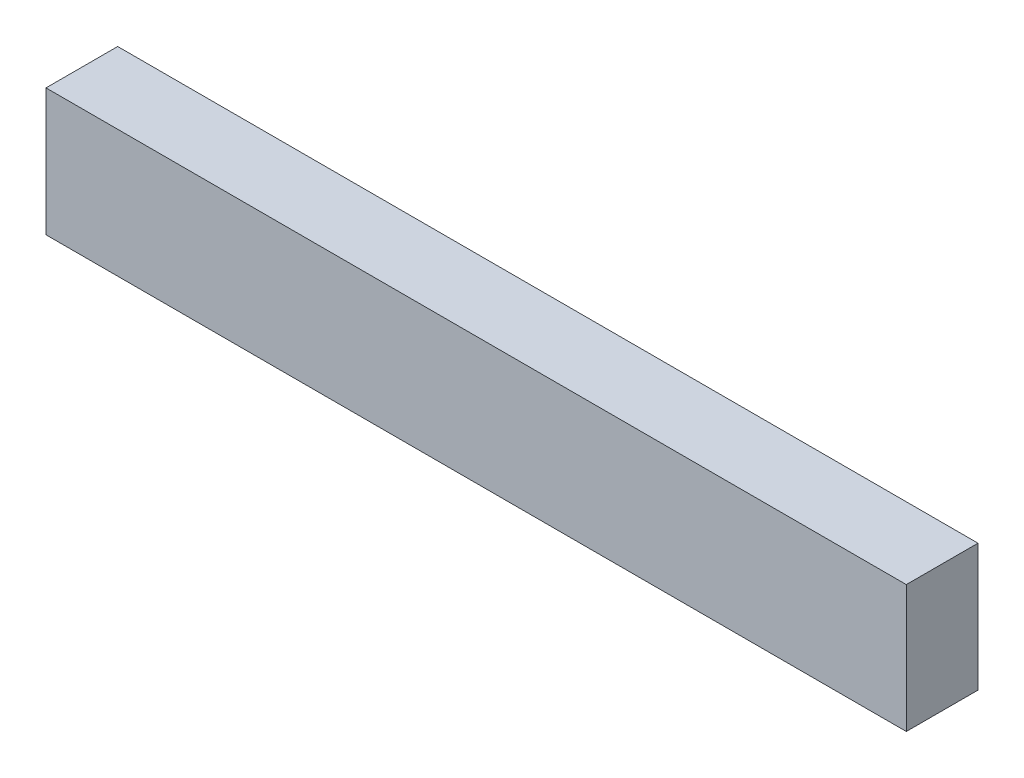
ISO-10303-21;
HEADER;
FILE_DESCRIPTION(('STEP AP214'),'2;1');
FILE_NAME('part.step','',(''),(''),'','','');
FILE_SCHEMA(('AUTOMOTIVE_DESIGN { 1 0 10303 214 1 1 1 1 }'));
ENDSEC;
DATA;
#1=APPLICATION_CONTEXT('core data for automotive mechanical design processes');
#2=APPLICATION_PROTOCOL_DEFINITION('international standard','automotive_design',2000,#1);
#3=PRODUCT_CONTEXT('',#1,'mechanical');
#4=PRODUCT('Part','Part','',(#3));
#5=PRODUCT_RELATED_PRODUCT_CATEGORY('part','',(#4));
#6=PRODUCT_DEFINITION_FORMATION('','',#4);
#7=PRODUCT_DEFINITION_CONTEXT('part definition',#1,'design');
#8=PRODUCT_DEFINITION('design','',#6,#7);
#9=PRODUCT_DEFINITION_SHAPE('','',#8);
#10=(LENGTH_UNIT() NAMED_UNIT(*) SI_UNIT(.MILLI.,.METRE.));
#11=(NAMED_UNIT(*) PLANE_ANGLE_UNIT() SI_UNIT($,.RADIAN.));
#12=(NAMED_UNIT(*) SI_UNIT($,.STERADIAN.) SOLID_ANGLE_UNIT());
#13=UNCERTAINTY_MEASURE_WITH_UNIT(LENGTH_MEASURE(1.E-05),#10,'distance_accuracy_value','');
#14=(GEOMETRIC_REPRESENTATION_CONTEXT(3) GLOBAL_UNCERTAINTY_ASSIGNED_CONTEXT((#13)) GLOBAL_UNIT_ASSIGNED_CONTEXT((#10,
#11,#12)) REPRESENTATION_CONTEXT('',''));
#15=CARTESIAN_POINT('',(0.,0.,0.));
#16=DIRECTION('',(0.,0.,1.));
#17=DIRECTION('',(1.,0.,0.));
#18=AXIS2_PLACEMENT_3D('',#15,#16,#17);
#19=CARTESIAN_POINT('',(24.,3.55,4.));
#20=DIRECTION('',(-1.,0.,0.));
#21=DIRECTION('',(0.,0.,1.));
#22=AXIS2_PLACEMENT_3D('',#19,#20,#21);
#23=PLANE('',#22);
#24=DIRECTION('',(0.,1.,0.));
#25=VECTOR('',#24,1.);
#26=CARTESIAN_POINT('',(24.,3.55,0.));
#27=LINE('',#26,#25);
#28=CARTESIAN_POINT('',(24.,-3.55,0.));
#29=VERTEX_POINT('',#28);
#30=CARTESIAN_POINT('',(24.,3.55,0.));
#31=VERTEX_POINT('',#30);
#32=EDGE_CURVE('E119',#29,#31,#27,.T.);
#33=ORIENTED_EDGE('',*,*,#32,.T.);
#34=DIRECTION('',(0.,0.,-1.));
#35=VECTOR('',#34,1.);
#36=CARTESIAN_POINT('',(24.,3.55,4.));
#37=LINE('',#36,#35);
#38=CARTESIAN_POINT('',(24.,3.55,4.));
#39=VERTEX_POINT('',#38);
#40=EDGE_CURVE('E11',#39,#31,#37,.T.);
#41=ORIENTED_EDGE('',*,*,#40,.F.);
#42=DIRECTION('',(0.,1.,0.));
#43=VECTOR('',#42,1.);
#44=CARTESIAN_POINT('',(24.,3.55,4.));
#45=LINE('',#44,#43);
#46=CARTESIAN_POINT('',(24.,-3.55,4.));
#47=VERTEX_POINT('',#46);
#48=EDGE_CURVE('E103',#47,#39,#45,.T.);
#49=ORIENTED_EDGE('',*,*,#48,.F.);
#50=DIRECTION('',(0.,0.,-1.));
#51=VECTOR('',#50,1.);
#52=CARTESIAN_POINT('',(24.,-3.55,4.));
#53=LINE('',#52,#51);
#54=EDGE_CURVE('E115',#47,#29,#53,.T.);
#55=ORIENTED_EDGE('',*,*,#54,.T.);
#56=EDGE_LOOP('',(#33,#41,#49,#55));
#57=FACE_BOUND('',#56,.T.);
#58=ADVANCED_FACE('F51',(#57),#23,.F.);
#59=CARTESIAN_POINT('',(-24.,3.55,4.));
#60=DIRECTION('',(0.,-1.,0.));
#61=DIRECTION('',(0.,0.,-1.));
#62=AXIS2_PLACEMENT_3D('',#59,#60,#61);
#63=PLANE('',#62);
#64=DIRECTION('',(-1.,0.,0.));
#65=VECTOR('',#64,1.);
#66=CARTESIAN_POINT('',(-24.,3.55,0.));
#67=LINE('',#66,#65);
#68=CARTESIAN_POINT('',(-24.,3.55,0.));
#69=VERTEX_POINT('',#68);
#70=EDGE_CURVE('E108',#31,#69,#67,.T.);
#71=ORIENTED_EDGE('',*,*,#70,.T.);
#72=DIRECTION('',(0.,0.,-1.));
#73=VECTOR('',#72,1.);
#74=CARTESIAN_POINT('',(-24.,3.55,4.));
#75=LINE('',#74,#73);
#76=CARTESIAN_POINT('',(-24.,3.55,4.));
#77=VERTEX_POINT('',#76);
#78=EDGE_CURVE('E60',#77,#69,#75,.T.);
#79=ORIENTED_EDGE('',*,*,#78,.F.);
#80=DIRECTION('',(-1.,0.,0.));
#81=VECTOR('',#80,1.);
#82=CARTESIAN_POINT('',(-24.,3.55,4.));
#83=LINE('',#82,#81);
#84=EDGE_CURVE('E98',#39,#77,#83,.T.);
#85=ORIENTED_EDGE('',*,*,#84,.F.);
#86=ORIENTED_EDGE('',*,*,#40,.T.);
#87=EDGE_LOOP('',(#71,#79,#85,#86));
#88=FACE_BOUND('',#87,.T.);
#89=ADVANCED_FACE('F107',(#88),#63,.F.);
#90=CARTESIAN_POINT('',(-24.,3.55,4.));
#91=DIRECTION('',(1.,0.,0.));
#92=DIRECTION('',(0.,0.,-1.));
#93=AXIS2_PLACEMENT_3D('',#90,#91,#92);
#94=PLANE('',#93);
#95=DIRECTION('',(0.,-1.,0.));
#96=VECTOR('',#95,1.);
#97=CARTESIAN_POINT('',(-24.,3.55,0.));
#98=LINE('',#97,#96);
#99=CARTESIAN_POINT('',(-24.,-3.55,0.));
#100=VERTEX_POINT('',#99);
#101=EDGE_CURVE('E85',#69,#100,#98,.T.);
#102=ORIENTED_EDGE('',*,*,#101,.T.);
#103=DIRECTION('',(0.,0.,-1.));
#104=VECTOR('',#103,1.);
#105=CARTESIAN_POINT('',(-24.,-3.55,4.));
#106=LINE('',#105,#104);
#107=CARTESIAN_POINT('',(-24.,-3.55,4.));
#108=VERTEX_POINT('',#107);
#109=EDGE_CURVE('E110',#108,#100,#106,.T.);
#110=ORIENTED_EDGE('',*,*,#109,.F.);
#111=DIRECTION('',(0.,-1.,0.));
#112=VECTOR('',#111,1.);
#113=CARTESIAN_POINT('',(-24.,3.55,4.));
#114=LINE('',#113,#112);
#115=EDGE_CURVE('E101',#77,#108,#114,.T.);
#116=ORIENTED_EDGE('',*,*,#115,.F.);
#117=ORIENTED_EDGE('',*,*,#78,.T.);
#118=EDGE_LOOP('',(#102,#110,#116,#117));
#119=FACE_BOUND('',#118,.T.);
#120=ADVANCED_FACE('F111',(#119),#94,.F.);
#121=CARTESIAN_POINT('',(-24.,-3.55,4.));
#122=DIRECTION('',(0.,1.,0.));
#123=DIRECTION('',(0.,0.,1.));
#124=AXIS2_PLACEMENT_3D('',#121,#122,#123);
#125=PLANE('',#124);
#126=DIRECTION('',(1.,0.,0.));
#127=VECTOR('',#126,1.);
#128=CARTESIAN_POINT('',(-24.,-3.55,0.));
#129=LINE('',#128,#127);
#130=EDGE_CURVE('E91',#100,#29,#129,.T.);
#131=ORIENTED_EDGE('',*,*,#130,.T.);
#132=ORIENTED_EDGE('',*,*,#54,.F.);
#133=DIRECTION('',(1.,0.,0.));
#134=VECTOR('',#133,1.);
#135=CARTESIAN_POINT('',(-24.,-3.55,4.));
#136=LINE('',#135,#134);
#137=EDGE_CURVE('E68',#108,#47,#136,.T.);
#138=ORIENTED_EDGE('',*,*,#137,.F.);
#139=ORIENTED_EDGE('',*,*,#109,.T.);
#140=EDGE_LOOP('',(#131,#132,#138,#139));
#141=FACE_BOUND('',#140,.T.);
#142=ADVANCED_FACE('F132',(#141),#125,.F.);
#143=CARTESIAN_POINT('',(0.,0.,4.));
#144=DIRECTION('',(0.,0.,1.));
#145=DIRECTION('',(1.,0.,0.));
#146=AXIS2_PLACEMENT_3D('',#143,#144,#145);
#147=PLANE('',#146);
#148=ORIENTED_EDGE('',*,*,#48,.T.);
#149=ORIENTED_EDGE('',*,*,#84,.T.);
#150=ORIENTED_EDGE('',*,*,#115,.T.);
#151=ORIENTED_EDGE('',*,*,#137,.T.);
#152=EDGE_LOOP('',(#148,#149,#150,#151));
#153=FACE_BOUND('',#152,.T.);
#154=ADVANCED_FACE('F99',(#153),#147,.T.);
#155=CARTESIAN_POINT('',(0.,0.,0.));
#156=DIRECTION('',(0.,0.,1.));
#157=DIRECTION('',(1.,0.,0.));
#158=AXIS2_PLACEMENT_3D('',#155,#156,#157);
#159=PLANE('',#158);
#160=ORIENTED_EDGE('',*,*,#32,.F.);
#161=ORIENTED_EDGE('',*,*,#130,.F.);
#162=ORIENTED_EDGE('',*,*,#101,.F.);
#163=ORIENTED_EDGE('',*,*,#70,.F.);
#164=EDGE_LOOP('',(#160,#161,#162,#163));
#165=FACE_BOUND('',#164,.T.);
#166=ADVANCED_FACE('F135',(#165),#159,.F.);
#167=CLOSED_SHELL('',(#58,#89,#120,#142,#154,#166));
#168=MANIFOLD_SOLID_BREP('B2',#167);
#169=ADVANCED_BREP_SHAPE_REPRESENTATION('',(#18,#168),#14);
#170=SHAPE_DEFINITION_REPRESENTATION(#9,#169);
ENDSEC;
END-ISO-10303-21;
